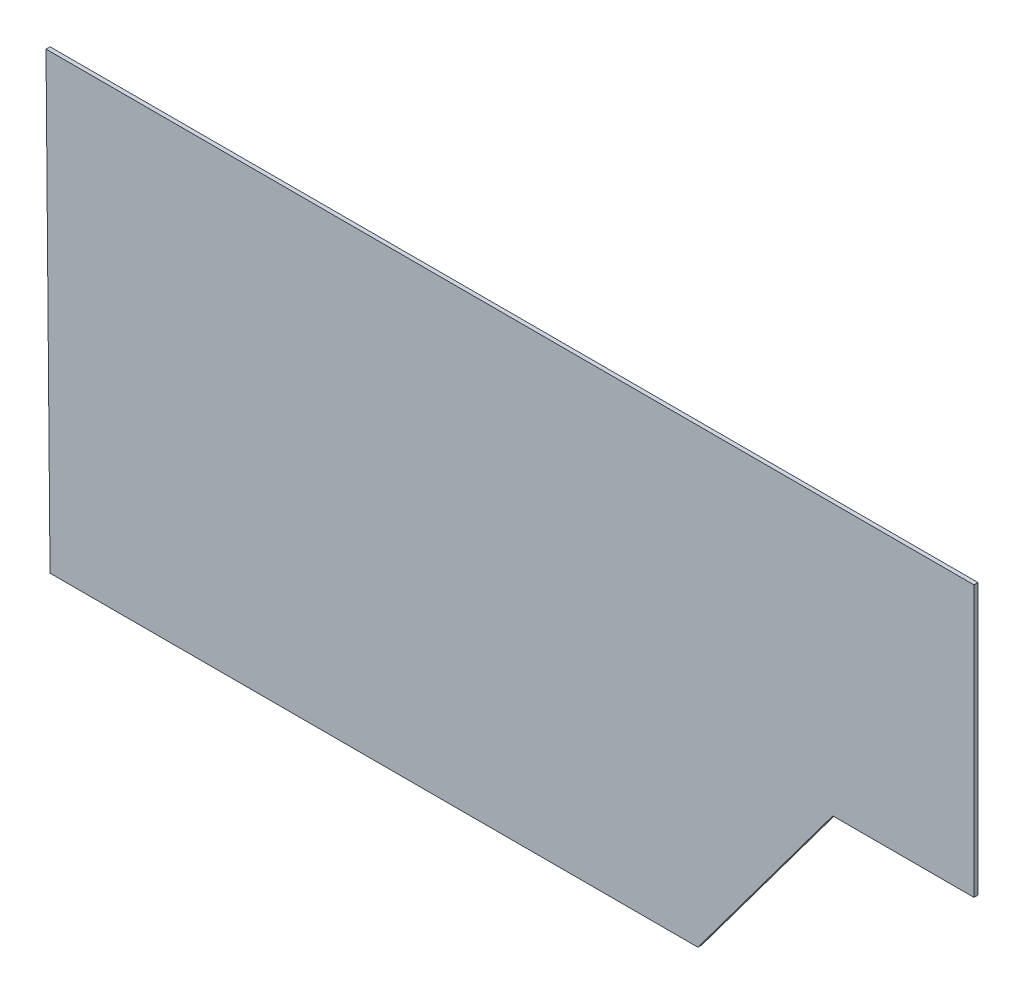
ISO-10303-21;
HEADER;
FILE_DESCRIPTION(('STEP AP214'),'2;1');
FILE_NAME('part.step','',(''),(''),'','','');
FILE_SCHEMA(('AUTOMOTIVE_DESIGN { 1 0 10303 214 1 1 1 1 }'));
ENDSEC;
DATA;
#1=APPLICATION_CONTEXT('core data for automotive mechanical design processes');
#2=APPLICATION_PROTOCOL_DEFINITION('international standard','automotive_design',2000,#1);
#3=PRODUCT_CONTEXT('',#1,'mechanical');
#4=PRODUCT('Part','Part','',(#3));
#5=PRODUCT_RELATED_PRODUCT_CATEGORY('part','',(#4));
#6=PRODUCT_DEFINITION_FORMATION('','',#4);
#7=PRODUCT_DEFINITION_CONTEXT('part definition',#1,'design');
#8=PRODUCT_DEFINITION('design','',#6,#7);
#9=PRODUCT_DEFINITION_SHAPE('','',#8);
#10=(LENGTH_UNIT() NAMED_UNIT(*) SI_UNIT(.MILLI.,.METRE.));
#11=(NAMED_UNIT(*) PLANE_ANGLE_UNIT() SI_UNIT($,.RADIAN.));
#12=(NAMED_UNIT(*) SI_UNIT($,.STERADIAN.) SOLID_ANGLE_UNIT());
#13=UNCERTAINTY_MEASURE_WITH_UNIT(LENGTH_MEASURE(1.E-05),#10,'distance_accuracy_value','');
#14=(GEOMETRIC_REPRESENTATION_CONTEXT(3) GLOBAL_UNCERTAINTY_ASSIGNED_CONTEXT((#13)) GLOBAL_UNIT_ASSIGNED_CONTEXT((#10,
#11,#12)) REPRESENTATION_CONTEXT('',''));
#15=CARTESIAN_POINT('',(0.,0.,0.));
#16=DIRECTION('',(0.,0.,1.));
#17=DIRECTION('',(1.,0.,0.));
#18=AXIS2_PLACEMENT_3D('',#15,#16,#17);
#19=CARTESIAN_POINT('',(-790.231317194732,90.909375740857,128.020467364411));
#20=DIRECTION('',(0.,1.,0.));
#21=DIRECTION('',(0.,0.,-1.));
#22=AXIS2_PLACEMENT_3D('',#19,#20,#21);
#23=PLANE('',#22);
#24=DIRECTION('',(-1.,0.,0.));
#25=VECTOR('',#24,1.);
#26=CARTESIAN_POINT('',(-790.231317194732,90.909375740857,127.020467364411));
#27=LINE('',#26,#25);
#28=CARTESIAN_POINT('',(-755.231317194732,90.909375740857,127.020467364411));
#29=VERTEX_POINT('',#28);
#30=CARTESIAN_POINT('',(-790.231317194732,90.909375740857,127.020467364411));
#31=VERTEX_POINT('',#30);
#32=EDGE_CURVE('E121',#29,#31,#27,.T.);
#33=ORIENTED_EDGE('',*,*,#32,.F.);
#34=DIRECTION('',(0.,0.,-1.));
#35=VECTOR('',#34,1.);
#36=CARTESIAN_POINT('',(-755.231317194732,90.909375740857,128.020467364411));
#37=LINE('',#36,#35);
#38=CARTESIAN_POINT('',(-755.231317194732,90.909375740857,128.020467364411));
#39=VERTEX_POINT('',#38);
#40=EDGE_CURVE('E120',#39,#29,#37,.T.);
#41=ORIENTED_EDGE('',*,*,#40,.F.);
#42=DIRECTION('',(-1.,0.,0.));
#43=VECTOR('',#42,1.);
#44=CARTESIAN_POINT('',(-790.231317194732,90.909375740857,128.020467364411));
#45=LINE('',#44,#43);
#46=CARTESIAN_POINT('',(-790.231317194732,90.909375740857,128.020467364411));
#47=VERTEX_POINT('',#46);
#48=EDGE_CURVE('E133',#39,#47,#45,.T.);
#49=ORIENTED_EDGE('',*,*,#48,.T.);
#50=DIRECTION('',(0.,0.,-1.));
#51=VECTOR('',#50,1.);
#52=CARTESIAN_POINT('',(-790.231317194732,90.909375740857,128.020467364411));
#53=LINE('',#52,#51);
#54=EDGE_CURVE('E11',#47,#31,#53,.T.);
#55=ORIENTED_EDGE('',*,*,#54,.T.);
#56=EDGE_LOOP('',(#33,#41,#49,#55));
#57=FACE_BOUND('',#56,.T.);
#58=ADVANCED_FACE('F38',(#57),#23,.F.);
#59=CARTESIAN_POINT('',(-823.655113571501,45.9999999999999,128.020467364411));
#60=DIRECTION('',(-0.802208704708494,0.597043712042862,0.));
#61=DIRECTION('',(-0.597043712042862,-0.802208704708494,0.));
#62=AXIS2_PLACEMENT_3D('',#59,#60,#61);
#63=PLANE('',#62);
#64=DIRECTION('',(-0.597043712042862,-0.802208704708494,0.));
#65=VECTOR('',#64,1.);
#66=CARTESIAN_POINT('',(-823.655113571501,45.9999999999999,127.020467364411));
#67=LINE('',#66,#65);
#68=CARTESIAN_POINT('',(-823.655113571501,45.9999999999999,127.020467364411));
#69=VERTEX_POINT('',#68);
#70=EDGE_CURVE('E123',#31,#69,#67,.T.);
#71=ORIENTED_EDGE('',*,*,#70,.F.);
#72=ORIENTED_EDGE('',*,*,#54,.F.);
#73=DIRECTION('',(-0.597043712042862,-0.802208704708494,0.));
#74=VECTOR('',#73,1.);
#75=CARTESIAN_POINT('',(-823.655113571501,45.9999999999999,128.020467364411));
#76=LINE('',#75,#74);
#77=CARTESIAN_POINT('',(-823.655113571501,45.9999999999999,128.020467364411));
#78=VERTEX_POINT('',#77);
#79=EDGE_CURVE('E86',#47,#78,#76,.T.);
#80=ORIENTED_EDGE('',*,*,#79,.T.);
#81=DIRECTION('',(0.,0.,-1.));
#82=VECTOR('',#81,1.);
#83=CARTESIAN_POINT('',(-823.655113571501,45.9999999999999,128.020467364411));
#84=LINE('',#83,#82);
#85=EDGE_CURVE('E46',#78,#69,#84,.T.);
#86=ORIENTED_EDGE('',*,*,#85,.T.);
#87=EDGE_LOOP('',(#71,#72,#80,#86));
#88=FACE_BOUND('',#87,.T.);
#89=ADVANCED_FACE('F139',(#88),#63,.F.);
#90=CARTESIAN_POINT('',(-984.231317194732,45.9999999999999,128.020467364411));
#91=DIRECTION('',(0.,1.,0.));
#92=DIRECTION('',(0.,0.,-1.));
#93=AXIS2_PLACEMENT_3D('',#90,#91,#92);
#94=PLANE('',#93);
#95=DIRECTION('',(-1.,0.,0.));
#96=VECTOR('',#95,1.);
#97=CARTESIAN_POINT('',(-984.231317194732,45.9999999999999,127.020467364411));
#98=LINE('',#97,#96);
#99=CARTESIAN_POINT('',(-984.231317194732,45.9999999999999,127.020467364411));
#100=VERTEX_POINT('',#99);
#101=EDGE_CURVE('E126',#69,#100,#98,.T.);
#102=ORIENTED_EDGE('',*,*,#101,.F.);
#103=ORIENTED_EDGE('',*,*,#85,.F.);
#104=DIRECTION('',(-1.,0.,0.));
#105=VECTOR('',#104,1.);
#106=CARTESIAN_POINT('',(-984.231317194732,45.9999999999999,128.020467364411));
#107=LINE('',#106,#105);
#108=CARTESIAN_POINT('',(-984.231317194732,45.9999999999999,128.020467364411));
#109=VERTEX_POINT('',#108);
#110=EDGE_CURVE('E114',#78,#109,#107,.T.);
#111=ORIENTED_EDGE('',*,*,#110,.T.);
#112=DIRECTION('',(0.,0.,-1.));
#113=VECTOR('',#112,1.);
#114=CARTESIAN_POINT('',(-984.231317194732,45.9999999999999,128.020467364411));
#115=LINE('',#114,#113);
#116=EDGE_CURVE('E108',#109,#100,#115,.T.);
#117=ORIENTED_EDGE('',*,*,#116,.T.);
#118=EDGE_LOOP('',(#102,#103,#111,#117));
#119=FACE_BOUND('',#118,.T.);
#120=ADVANCED_FACE('F161',(#119),#94,.F.);
#121=CARTESIAN_POINT('',(-985.231317194732,158.,128.020467364411));
#122=DIRECTION('',(0.999960142689157,0.00892821555972462,0.));
#123=DIRECTION('',(-0.00892821555972462,0.999960142689157,0.));
#124=AXIS2_PLACEMENT_3D('',#121,#122,#123);
#125=PLANE('',#124);
#126=DIRECTION('',(-0.00892821555972462,0.999960142689157,0.));
#127=VECTOR('',#126,1.);
#128=CARTESIAN_POINT('',(-985.231317194732,158.,127.020467364411));
#129=LINE('',#128,#127);
#130=CARTESIAN_POINT('',(-985.231317194732,158.,127.020467364411));
#131=VERTEX_POINT('',#130);
#132=EDGE_CURVE('E129',#100,#131,#129,.T.);
#133=ORIENTED_EDGE('',*,*,#132,.F.);
#134=ORIENTED_EDGE('',*,*,#116,.F.);
#135=DIRECTION('',(-0.00892821555972462,0.999960142689157,0.));
#136=VECTOR('',#135,1.);
#137=CARTESIAN_POINT('',(-985.231317194732,158.,128.020467364411));
#138=LINE('',#137,#136);
#139=CARTESIAN_POINT('',(-985.231317194732,158.,128.020467364411));
#140=VERTEX_POINT('',#139);
#141=EDGE_CURVE('E98',#109,#140,#138,.T.);
#142=ORIENTED_EDGE('',*,*,#141,.T.);
#143=DIRECTION('',(0.,0.,-1.));
#144=VECTOR('',#143,1.);
#145=CARTESIAN_POINT('',(-985.231317194732,158.,128.020467364411));
#146=LINE('',#145,#144);
#147=EDGE_CURVE('E103',#140,#131,#146,.T.);
#148=ORIENTED_EDGE('',*,*,#147,.T.);
#149=EDGE_LOOP('',(#133,#134,#142,#148));
#150=FACE_BOUND('',#149,.T.);
#151=ADVANCED_FACE('F111',(#150),#125,.F.);
#152=CARTESIAN_POINT('',(-755.231317194732,158.,128.020467364411));
#153=DIRECTION('',(0.,-1.,0.));
#154=DIRECTION('',(0.,0.,1.));
#155=AXIS2_PLACEMENT_3D('',#152,#153,#154);
#156=PLANE('',#155);
#157=DIRECTION('',(1.,0.,0.));
#158=VECTOR('',#157,1.);
#159=CARTESIAN_POINT('',(-755.231317194732,158.,127.020467364411));
#160=LINE('',#159,#158);
#161=CARTESIAN_POINT('',(-755.231317194732,158.,127.020467364411));
#162=VERTEX_POINT('',#161);
#163=EDGE_CURVE('E105',#131,#162,#160,.T.);
#164=ORIENTED_EDGE('',*,*,#163,.F.);
#165=ORIENTED_EDGE('',*,*,#147,.F.);
#166=DIRECTION('',(1.,0.,0.));
#167=VECTOR('',#166,1.);
#168=CARTESIAN_POINT('',(-755.231317194732,158.,128.020467364411));
#169=LINE('',#168,#167);
#170=CARTESIAN_POINT('',(-755.231317194732,158.,128.020467364411));
#171=VERTEX_POINT('',#170);
#172=EDGE_CURVE('E94',#140,#171,#169,.T.);
#173=ORIENTED_EDGE('',*,*,#172,.T.);
#174=DIRECTION('',(0.,0.,-1.));
#175=VECTOR('',#174,1.);
#176=CARTESIAN_POINT('',(-755.231317194732,158.,128.020467364411));
#177=LINE('',#176,#175);
#178=EDGE_CURVE('E109',#171,#162,#177,.T.);
#179=ORIENTED_EDGE('',*,*,#178,.T.);
#180=EDGE_LOOP('',(#164,#165,#173,#179));
#181=FACE_BOUND('',#180,.T.);
#182=ADVANCED_FACE('F104',(#181),#156,.F.);
#183=CARTESIAN_POINT('',(-755.231317194732,90.909375740857,128.020467364411));
#184=DIRECTION('',(-1.,0.,0.));
#185=DIRECTION('',(0.,0.,-1.));
#186=AXIS2_PLACEMENT_3D('',#183,#184,#185);
#187=PLANE('',#186);
#188=DIRECTION('',(0.,-1.,0.));
#189=VECTOR('',#188,1.);
#190=CARTESIAN_POINT('',(-755.231317194732,90.909375740857,127.020467364411));
#191=LINE('',#190,#189);
#192=EDGE_CURVE('E74',#162,#29,#191,.T.);
#193=ORIENTED_EDGE('',*,*,#192,.F.);
#194=ORIENTED_EDGE('',*,*,#178,.F.);
#195=DIRECTION('',(0.,-1.,0.));
#196=VECTOR('',#195,1.);
#197=CARTESIAN_POINT('',(-755.231317194732,90.909375740857,128.020467364411));
#198=LINE('',#197,#196);
#199=EDGE_CURVE('E54',#171,#39,#198,.T.);
#200=ORIENTED_EDGE('',*,*,#199,.T.);
#201=ORIENTED_EDGE('',*,*,#40,.T.);
#202=EDGE_LOOP('',(#193,#194,#200,#201));
#203=FACE_BOUND('',#202,.T.);
#204=ADVANCED_FACE('F147',(#203),#187,.F.);
#205=CARTESIAN_POINT('',(0.,0.,128.020467364411));
#206=DIRECTION('',(0.,0.,-1.));
#207=DIRECTION('',(1.,0.,0.));
#208=AXIS2_PLACEMENT_3D('',#205,#206,#207);
#209=PLANE('',#208);
#210=ORIENTED_EDGE('',*,*,#48,.F.);
#211=ORIENTED_EDGE('',*,*,#199,.F.);
#212=ORIENTED_EDGE('',*,*,#172,.F.);
#213=ORIENTED_EDGE('',*,*,#141,.F.);
#214=ORIENTED_EDGE('',*,*,#110,.F.);
#215=ORIENTED_EDGE('',*,*,#79,.F.);
#216=EDGE_LOOP('',(#210,#211,#212,#213,#214,#215));
#217=FACE_BOUND('',#216,.T.);
#218=ADVANCED_FACE('F96',(#217),#209,.F.);
#219=CARTESIAN_POINT('',(0.,0.,127.020467364411));
#220=DIRECTION('',(0.,0.,-1.));
#221=DIRECTION('',(1.,0.,0.));
#222=AXIS2_PLACEMENT_3D('',#219,#220,#221);
#223=PLANE('',#222);
#224=ORIENTED_EDGE('',*,*,#32,.T.);
#225=ORIENTED_EDGE('',*,*,#70,.T.);
#226=ORIENTED_EDGE('',*,*,#101,.T.);
#227=ORIENTED_EDGE('',*,*,#132,.T.);
#228=ORIENTED_EDGE('',*,*,#163,.T.);
#229=ORIENTED_EDGE('',*,*,#192,.T.);
#230=EDGE_LOOP('',(#224,#225,#226,#227,#228,#229));
#231=FACE_BOUND('',#230,.T.);
#232=ADVANCED_FACE('F141',(#231),#223,.T.);
#233=CLOSED_SHELL('',(#58,#89,#120,#151,#182,#204,#218,#232));
#234=MANIFOLD_SOLID_BREP('B2',#233);
#235=ADVANCED_BREP_SHAPE_REPRESENTATION('',(#18,#234),#14);
#236=SHAPE_DEFINITION_REPRESENTATION(#9,#235);
ENDSEC;
END-ISO-10303-21;
